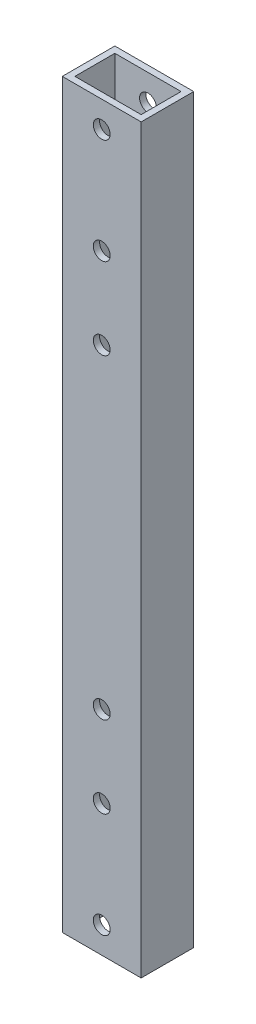
ISO-10303-21;
HEADER;
FILE_DESCRIPTION(('STEP AP214'),'2;1');
FILE_NAME('part.step','',(''),(''),'','','');
FILE_SCHEMA(('AUTOMOTIVE_DESIGN { 1 0 10303 214 1 1 1 1 }'));
ENDSEC;
DATA;
#1=APPLICATION_CONTEXT('core data for automotive mechanical design processes');
#2=APPLICATION_PROTOCOL_DEFINITION('international standard','automotive_design',2000,#1);
#3=PRODUCT_CONTEXT('',#1,'mechanical');
#4=PRODUCT('Part','Part','',(#3));
#5=PRODUCT_RELATED_PRODUCT_CATEGORY('part','',(#4));
#6=PRODUCT_DEFINITION_FORMATION('','',#4);
#7=PRODUCT_DEFINITION_CONTEXT('part definition',#1,'design');
#8=PRODUCT_DEFINITION('design','',#6,#7);
#9=PRODUCT_DEFINITION_SHAPE('','',#8);
#10=(LENGTH_UNIT() NAMED_UNIT(*) SI_UNIT(.MILLI.,.METRE.));
#11=(NAMED_UNIT(*) PLANE_ANGLE_UNIT() SI_UNIT($,.RADIAN.));
#12=(NAMED_UNIT(*) SI_UNIT($,.STERADIAN.) SOLID_ANGLE_UNIT());
#13=UNCERTAINTY_MEASURE_WITH_UNIT(LENGTH_MEASURE(1.E-05),#10,'distance_accuracy_value','');
#14=(GEOMETRIC_REPRESENTATION_CONTEXT(3) GLOBAL_UNCERTAINTY_ASSIGNED_CONTEXT((#13)) GLOBAL_UNIT_ASSIGNED_CONTEXT((#10,
#11,#12)) REPRESENTATION_CONTEXT('',''));
#15=CARTESIAN_POINT('',(0.,0.,0.));
#16=DIRECTION('',(0.,0.,1.));
#17=DIRECTION('',(1.,0.,0.));
#18=AXIS2_PLACEMENT_3D('',#15,#16,#17);
#19=CARTESIAN_POINT('',(0.,70.5,0.));
#20=DIRECTION('',(0.,1.,0.));
#21=DIRECTION('',(0.,0.,1.));
#22=AXIS2_PLACEMENT_3D('',#19,#20,#21);
#23=PLANE('',#22);
#24=DIRECTION('',(0.,0.,-1.));
#25=VECTOR('',#24,1.);
#26=CARTESIAN_POINT('',(7.5,70.5,-5.));
#27=LINE('',#26,#25);
#28=CARTESIAN_POINT('',(7.5,70.5,5.));
#29=VERTEX_POINT('',#28);
#30=CARTESIAN_POINT('',(7.5,70.5,-5.));
#31=VERTEX_POINT('',#30);
#32=EDGE_CURVE('E146',#29,#31,#27,.T.);
#33=ORIENTED_EDGE('',*,*,#32,.T.);
#34=DIRECTION('',(-1.,0.,0.));
#35=VECTOR('',#34,1.);
#36=CARTESIAN_POINT('',(-7.5,70.5,-5.));
#37=LINE('',#36,#35);
#38=CARTESIAN_POINT('',(-7.5,70.5,-5.));
#39=VERTEX_POINT('',#38);
#40=EDGE_CURVE('E149',#31,#39,#37,.T.);
#41=ORIENTED_EDGE('',*,*,#40,.T.);
#42=DIRECTION('',(0.,0.,1.));
#43=VECTOR('',#42,1.);
#44=CARTESIAN_POINT('',(-7.5,70.5,-5.));
#45=LINE('',#44,#43);
#46=CARTESIAN_POINT('',(-7.5,70.5,5.));
#47=VERTEX_POINT('',#46);
#48=EDGE_CURVE('E152',#39,#47,#45,.T.);
#49=ORIENTED_EDGE('',*,*,#48,.T.);
#50=DIRECTION('',(1.,0.,0.));
#51=VECTOR('',#50,1.);
#52=CARTESIAN_POINT('',(-7.5,70.5,5.));
#53=LINE('',#52,#51);
#54=EDGE_CURVE('E154',#47,#29,#53,.T.);
#55=ORIENTED_EDGE('',*,*,#54,.T.);
#56=EDGE_LOOP('',(#33,#41,#49,#55));
#57=FACE_BOUND('',#56,.T.);
#58=DIRECTION('',(1.,0.,0.));
#59=VECTOR('',#58,1.);
#60=CARTESIAN_POINT('',(-6.3,70.5,3.8));
#61=LINE('',#60,#59);
#62=CARTESIAN_POINT('',(-6.3,70.5,3.8));
#63=VERTEX_POINT('',#62);
#64=CARTESIAN_POINT('',(6.3,70.5,3.8));
#65=VERTEX_POINT('',#64);
#66=EDGE_CURVE('E116',#63,#65,#61,.T.);
#67=ORIENTED_EDGE('',*,*,#66,.F.);
#68=DIRECTION('',(0.,0.,1.));
#69=VECTOR('',#68,1.);
#70=CARTESIAN_POINT('',(-6.3,70.5,-3.8));
#71=LINE('',#70,#69);
#72=CARTESIAN_POINT('',(-6.3,70.5,-3.8));
#73=VERTEX_POINT('',#72);
#74=EDGE_CURVE('E108',#73,#63,#71,.T.);
#75=ORIENTED_EDGE('',*,*,#74,.F.);
#76=DIRECTION('',(-1.,0.,0.));
#77=VECTOR('',#76,1.);
#78=CARTESIAN_POINT('',(-6.3,70.5,-3.8));
#79=LINE('',#78,#77);
#80=CARTESIAN_POINT('',(6.3,70.5,-3.8));
#81=VERTEX_POINT('',#80);
#82=EDGE_CURVE('E130',#81,#73,#79,.T.);
#83=ORIENTED_EDGE('',*,*,#82,.F.);
#84=DIRECTION('',(0.,0.,-1.));
#85=VECTOR('',#84,1.);
#86=CARTESIAN_POINT('',(6.3,70.5,-3.8));
#87=LINE('',#86,#85);
#88=EDGE_CURVE('E128',#65,#81,#87,.T.);
#89=ORIENTED_EDGE('',*,*,#88,.F.);
#90=EDGE_LOOP('',(#67,#75,#83,#89));
#91=FACE_BOUND('',#90,.T.);
#92=ADVANCED_FACE('F41',(#57,#91),#23,.T.);
#93=CARTESIAN_POINT('',(0.,-70.5,0.));
#94=DIRECTION('',(0.,1.,0.));
#95=DIRECTION('',(0.,0.,1.));
#96=AXIS2_PLACEMENT_3D('',#93,#94,#95);
#97=PLANE('',#96);
#98=DIRECTION('',(0.,0.,-1.));
#99=VECTOR('',#98,1.);
#100=CARTESIAN_POINT('',(7.5,-70.5,-5.));
#101=LINE('',#100,#99);
#102=CARTESIAN_POINT('',(7.5,-70.5,5.));
#103=VERTEX_POINT('',#102);
#104=CARTESIAN_POINT('',(7.5,-70.5,-5.));
#105=VERTEX_POINT('',#104);
#106=EDGE_CURVE('E124',#103,#105,#101,.T.);
#107=ORIENTED_EDGE('',*,*,#106,.F.);
#108=DIRECTION('',(1.,0.,0.));
#109=VECTOR('',#108,1.);
#110=CARTESIAN_POINT('',(-7.5,-70.5,5.));
#111=LINE('',#110,#109);
#112=CARTESIAN_POINT('',(-7.5,-70.5,5.));
#113=VERTEX_POINT('',#112);
#114=EDGE_CURVE('E150',#113,#103,#111,.T.);
#115=ORIENTED_EDGE('',*,*,#114,.F.);
#116=DIRECTION('',(0.,0.,1.));
#117=VECTOR('',#116,1.);
#118=CARTESIAN_POINT('',(-7.5,-70.5,-5.));
#119=LINE('',#118,#117);
#120=CARTESIAN_POINT('',(-7.5,-70.5,-5.));
#121=VERTEX_POINT('',#120);
#122=EDGE_CURVE('E161',#121,#113,#119,.T.);
#123=ORIENTED_EDGE('',*,*,#122,.F.);
#124=DIRECTION('',(-1.,0.,0.));
#125=VECTOR('',#124,1.);
#126=CARTESIAN_POINT('',(-7.5,-70.5,-5.));
#127=LINE('',#126,#125);
#128=EDGE_CURVE('E159',#105,#121,#127,.T.);
#129=ORIENTED_EDGE('',*,*,#128,.F.);
#130=EDGE_LOOP('',(#107,#115,#123,#129));
#131=FACE_BOUND('',#130,.T.);
#132=DIRECTION('',(0.,0.,1.));
#133=VECTOR('',#132,1.);
#134=CARTESIAN_POINT('',(-6.3,-70.5,-3.8));
#135=LINE('',#134,#133);
#136=CARTESIAN_POINT('',(-6.3,-70.5,-3.8));
#137=VERTEX_POINT('',#136);
#138=CARTESIAN_POINT('',(-6.3,-70.5,3.8));
#139=VERTEX_POINT('',#138);
#140=EDGE_CURVE('E66',#137,#139,#135,.T.);
#141=ORIENTED_EDGE('',*,*,#140,.T.);
#142=DIRECTION('',(1.,0.,0.));
#143=VECTOR('',#142,1.);
#144=CARTESIAN_POINT('',(-6.3,-70.5,3.8));
#145=LINE('',#144,#143);
#146=CARTESIAN_POINT('',(6.3,-70.5,3.8));
#147=VERTEX_POINT('',#146);
#148=EDGE_CURVE('E123',#139,#147,#145,.T.);
#149=ORIENTED_EDGE('',*,*,#148,.T.);
#150=DIRECTION('',(0.,0.,-1.));
#151=VECTOR('',#150,1.);
#152=CARTESIAN_POINT('',(6.3,-70.5,-3.8));
#153=LINE('',#152,#151);
#154=CARTESIAN_POINT('',(6.3,-70.5,-3.8));
#155=VERTEX_POINT('',#154);
#156=EDGE_CURVE('E138',#147,#155,#153,.T.);
#157=ORIENTED_EDGE('',*,*,#156,.T.);
#158=DIRECTION('',(-1.,0.,0.));
#159=VECTOR('',#158,1.);
#160=CARTESIAN_POINT('',(-6.3,-70.5,-3.8));
#161=LINE('',#160,#159);
#162=EDGE_CURVE('E117',#155,#137,#161,.T.);
#163=ORIENTED_EDGE('',*,*,#162,.T.);
#164=EDGE_LOOP('',(#141,#149,#157,#163));
#165=FACE_BOUND('',#164,.T.);
#166=ADVANCED_FACE('F268',(#131,#165),#97,.F.);
#167=CARTESIAN_POINT('',(7.5,70.5,-5.));
#168=DIRECTION('',(-1.,0.,0.));
#169=DIRECTION('',(0.,0.,1.));
#170=AXIS2_PLACEMENT_3D('',#167,#168,#169);
#171=PLANE('',#170);
#172=ORIENTED_EDGE('',*,*,#106,.T.);
#173=DIRECTION('',(0.,-1.,0.));
#174=VECTOR('',#173,1.);
#175=CARTESIAN_POINT('',(7.5,70.5,-5.));
#176=LINE('',#175,#174);
#177=EDGE_CURVE('E11',#31,#105,#176,.T.);
#178=ORIENTED_EDGE('',*,*,#177,.F.);
#179=ORIENTED_EDGE('',*,*,#32,.F.);
#180=DIRECTION('',(0.,-1.,0.));
#181=VECTOR('',#180,1.);
#182=CARTESIAN_POINT('',(7.5,70.5,5.));
#183=LINE('',#182,#181);
#184=EDGE_CURVE('E156',#29,#103,#183,.T.);
#185=ORIENTED_EDGE('',*,*,#184,.T.);
#186=EDGE_LOOP('',(#172,#178,#179,#185));
#187=FACE_BOUND('',#186,.T.);
#188=ADVANCED_FACE('F43',(#187),#171,.F.);
#189=CARTESIAN_POINT('',(-7.5,70.5,-5.));
#190=DIRECTION('',(0.,0.,1.));
#191=DIRECTION('',(1.,0.,0.));
#192=AXIS2_PLACEMENT_3D('',#189,#190,#191);
#193=PLANE('',#192);
#194=CARTESIAN_POINT('',(3.99680288865056E-12,-29.9999999999937,-5.));
#195=DIRECTION('',(0.,0.,-1.));
#196=DIRECTION('',(-1.,0.,0.));
#197=AXIS2_PLACEMENT_3D('',#194,#195,#196);
#198=CIRCLE('',#197,1.60000000000185);
#199=CARTESIAN_POINT('',(-1.59999999999785,-29.9999999999937,-5.));
#200=VERTEX_POINT('',#199);
#201=EDGE_CURVE('E199',#200,#200,#198,.T.);
#202=ORIENTED_EDGE('',*,*,#201,.F.);
#203=EDGE_LOOP('',(#202));
#204=FACE_BOUND('',#203,.T.);
#205=CARTESIAN_POINT('',(3.99680288865056E-12,30.0000000000063,-5.));
#206=DIRECTION('',(0.,0.,-1.));
#207=DIRECTION('',(-1.,0.,0.));
#208=AXIS2_PLACEMENT_3D('',#205,#206,#207);
#209=CIRCLE('',#208,1.60000000000185);
#210=CARTESIAN_POINT('',(-1.59999999999785,30.0000000000063,-5.));
#211=VERTEX_POINT('',#210);
#212=EDGE_CURVE('E204',#211,#211,#209,.T.);
#213=ORIENTED_EDGE('',*,*,#212,.F.);
#214=EDGE_LOOP('',(#213));
#215=FACE_BOUND('',#214,.T.);
#216=CARTESIAN_POINT('',(0.,-65.5,-5.));
#217=DIRECTION('',(0.,0.,-1.));
#218=DIRECTION('',(-1.,0.,0.));
#219=AXIS2_PLACEMENT_3D('',#216,#217,#218);
#220=CIRCLE('',#219,1.60000000000001);
#221=CARTESIAN_POINT('',(-1.60000000000001,-65.5,-5.));
#222=VERTEX_POINT('',#221);
#223=EDGE_CURVE('E175',#222,#222,#220,.T.);
#224=ORIENTED_EDGE('',*,*,#223,.F.);
#225=EDGE_LOOP('',(#224));
#226=FACE_BOUND('',#225,.T.);
#227=CARTESIAN_POINT('',(0.,-45.5,-5.));
#228=DIRECTION('',(0.,0.,-1.));
#229=DIRECTION('',(-1.,0.,0.));
#230=AXIS2_PLACEMENT_3D('',#227,#228,#229);
#231=CIRCLE('',#230,1.6);
#232=CARTESIAN_POINT('',(-1.6,-45.5,-5.));
#233=VERTEX_POINT('',#232);
#234=EDGE_CURVE('E218',#233,#233,#231,.T.);
#235=ORIENTED_EDGE('',*,*,#234,.F.);
#236=EDGE_LOOP('',(#235));
#237=FACE_BOUND('',#236,.T.);
#238=CARTESIAN_POINT('',(0.,45.5,-5.));
#239=DIRECTION('',(0.,0.,-1.));
#240=DIRECTION('',(1.,0.,0.));
#241=AXIS2_PLACEMENT_3D('',#238,#239,#240);
#242=CIRCLE('',#241,1.6);
#243=CARTESIAN_POINT('',(1.59999999999999,45.5,-5.));
#244=VERTEX_POINT('',#243);
#245=EDGE_CURVE('E221',#244,#244,#242,.T.);
#246=ORIENTED_EDGE('',*,*,#245,.F.);
#247=EDGE_LOOP('',(#246));
#248=FACE_BOUND('',#247,.T.);
#249=CARTESIAN_POINT('',(0.,65.5,-5.));
#250=DIRECTION('',(0.,0.,-1.));
#251=DIRECTION('',(1.,0.,0.));
#252=AXIS2_PLACEMENT_3D('',#249,#250,#251);
#253=CIRCLE('',#252,1.60000000000001);
#254=CARTESIAN_POINT('',(1.6,65.5,-5.));
#255=VERTEX_POINT('',#254);
#256=EDGE_CURVE('E215',#255,#255,#253,.T.);
#257=ORIENTED_EDGE('',*,*,#256,.F.);
#258=EDGE_LOOP('',(#257));
#259=FACE_BOUND('',#258,.T.);
#260=ORIENTED_EDGE('',*,*,#128,.T.);
#261=DIRECTION('',(0.,-1.,0.));
#262=VECTOR('',#261,1.);
#263=CARTESIAN_POINT('',(-7.5,70.5,-5.));
#264=LINE('',#263,#262);
#265=EDGE_CURVE('E50',#39,#121,#264,.T.);
#266=ORIENTED_EDGE('',*,*,#265,.F.);
#267=ORIENTED_EDGE('',*,*,#40,.F.);
#268=ORIENTED_EDGE('',*,*,#177,.T.);
#269=EDGE_LOOP('',(#260,#266,#267,#268));
#270=FACE_BOUND('',#269,.T.);
#271=ADVANCED_FACE('F283',(#204,#215,#226,#237,#248,#259,#270),#193,.F.);
#272=CARTESIAN_POINT('',(-7.5,70.5,-5.));
#273=DIRECTION('',(1.,0.,0.));
#274=DIRECTION('',(0.,0.,-1.));
#275=AXIS2_PLACEMENT_3D('',#272,#273,#274);
#276=PLANE('',#275);
#277=ORIENTED_EDGE('',*,*,#122,.T.);
#278=DIRECTION('',(0.,-1.,0.));
#279=VECTOR('',#278,1.);
#280=CARTESIAN_POINT('',(-7.5,70.5,5.));
#281=LINE('',#280,#279);
#282=EDGE_CURVE('E166',#47,#113,#281,.T.);
#283=ORIENTED_EDGE('',*,*,#282,.F.);
#284=ORIENTED_EDGE('',*,*,#48,.F.);
#285=ORIENTED_EDGE('',*,*,#265,.T.);
#286=EDGE_LOOP('',(#277,#283,#284,#285));
#287=FACE_BOUND('',#286,.T.);
#288=ADVANCED_FACE('F281',(#287),#276,.F.);
#289=CARTESIAN_POINT('',(-7.5,70.5,5.));
#290=DIRECTION('',(0.,0.,-1.));
#291=DIRECTION('',(-1.,0.,0.));
#292=AXIS2_PLACEMENT_3D('',#289,#290,#291);
#293=PLANE('',#292);
#294=CARTESIAN_POINT('',(3.99680288865056E-12,-29.9999999999937,5.));
#295=DIRECTION('',(0.,0.,-1.));
#296=DIRECTION('',(-1.,0.,0.));
#297=AXIS2_PLACEMENT_3D('',#294,#295,#296);
#298=CIRCLE('',#297,1.60000000000185);
#299=CARTESIAN_POINT('',(-1.59999999999785,-29.9999999999937,5.));
#300=VERTEX_POINT('',#299);
#301=EDGE_CURVE('E193',#300,#300,#298,.T.);
#302=ORIENTED_EDGE('',*,*,#301,.T.);
#303=EDGE_LOOP('',(#302));
#304=FACE_BOUND('',#303,.T.);
#305=CARTESIAN_POINT('',(3.99680288865056E-12,30.0000000000063,5.));
#306=DIRECTION('',(0.,0.,-1.));
#307=DIRECTION('',(-1.,0.,0.));
#308=AXIS2_PLACEMENT_3D('',#305,#306,#307);
#309=CIRCLE('',#308,1.60000000000185);
#310=CARTESIAN_POINT('',(-1.59999999999785,30.0000000000063,5.));
#311=VERTEX_POINT('',#310);
#312=EDGE_CURVE('E209',#311,#311,#309,.T.);
#313=ORIENTED_EDGE('',*,*,#312,.T.);
#314=EDGE_LOOP('',(#313));
#315=FACE_BOUND('',#314,.T.);
#316=CARTESIAN_POINT('',(0.,-65.5,5.));
#317=DIRECTION('',(0.,0.,-1.));
#318=DIRECTION('',(-1.,0.,0.));
#319=AXIS2_PLACEMENT_3D('',#316,#317,#318);
#320=CIRCLE('',#319,1.60000000000001);
#321=CARTESIAN_POINT('',(-1.60000000000001,-65.5,5.));
#322=VERTEX_POINT('',#321);
#323=EDGE_CURVE('E136',#322,#322,#320,.T.);
#324=ORIENTED_EDGE('',*,*,#323,.T.);
#325=EDGE_LOOP('',(#324));
#326=FACE_BOUND('',#325,.T.);
#327=CARTESIAN_POINT('',(0.,-45.5,5.));
#328=DIRECTION('',(0.,0.,-1.));
#329=DIRECTION('',(-1.,0.,0.));
#330=AXIS2_PLACEMENT_3D('',#327,#328,#329);
#331=CIRCLE('',#330,1.6);
#332=CARTESIAN_POINT('',(-1.6,-45.5,5.));
#333=VERTEX_POINT('',#332);
#334=EDGE_CURVE('E189',#333,#333,#331,.T.);
#335=ORIENTED_EDGE('',*,*,#334,.T.);
#336=EDGE_LOOP('',(#335));
#337=FACE_BOUND('',#336,.T.);
#338=CARTESIAN_POINT('',(0.,45.5,5.));
#339=DIRECTION('',(0.,0.,-1.));
#340=DIRECTION('',(-1.,0.,0.));
#341=AXIS2_PLACEMENT_3D('',#338,#339,#340);
#342=CIRCLE('',#341,1.6);
#343=CARTESIAN_POINT('',(-1.6,45.5,5.));
#344=VERTEX_POINT('',#343);
#345=EDGE_CURVE('E185',#344,#344,#342,.T.);
#346=ORIENTED_EDGE('',*,*,#345,.T.);
#347=EDGE_LOOP('',(#346));
#348=FACE_BOUND('',#347,.T.);
#349=CARTESIAN_POINT('',(0.,65.5,5.));
#350=DIRECTION('',(0.,0.,-1.));
#351=DIRECTION('',(-1.,0.,0.));
#352=AXIS2_PLACEMENT_3D('',#349,#350,#351);
#353=CIRCLE('',#352,1.60000000000001);
#354=CARTESIAN_POINT('',(-1.60000000000001,65.5,5.));
#355=VERTEX_POINT('',#354);
#356=EDGE_CURVE('E180',#355,#355,#353,.T.);
#357=ORIENTED_EDGE('',*,*,#356,.T.);
#358=EDGE_LOOP('',(#357));
#359=FACE_BOUND('',#358,.T.);
#360=ORIENTED_EDGE('',*,*,#114,.T.);
#361=ORIENTED_EDGE('',*,*,#184,.F.);
#362=ORIENTED_EDGE('',*,*,#54,.F.);
#363=ORIENTED_EDGE('',*,*,#282,.T.);
#364=EDGE_LOOP('',(#360,#361,#362,#363));
#365=FACE_BOUND('',#364,.T.);
#366=ADVANCED_FACE('F242',(#304,#315,#326,#337,#348,#359,#365),#293,.F.);
#367=CARTESIAN_POINT('',(-6.3,70.5,-3.8));
#368=DIRECTION('',(1.,0.,0.));
#369=DIRECTION('',(0.,0.,-1.));
#370=AXIS2_PLACEMENT_3D('',#367,#368,#369);
#371=PLANE('',#370);
#372=ORIENTED_EDGE('',*,*,#140,.F.);
#373=DIRECTION('',(0.,-1.,0.));
#374=VECTOR('',#373,1.);
#375=CARTESIAN_POINT('',(-6.3,70.5,-3.8));
#376=LINE('',#375,#374);
#377=EDGE_CURVE('E112',#73,#137,#376,.T.);
#378=ORIENTED_EDGE('',*,*,#377,.F.);
#379=ORIENTED_EDGE('',*,*,#74,.T.);
#380=DIRECTION('',(0.,-1.,0.));
#381=VECTOR('',#380,1.);
#382=CARTESIAN_POINT('',(-6.3,70.5,3.8));
#383=LINE('',#382,#381);
#384=EDGE_CURVE('E111',#63,#139,#383,.T.);
#385=ORIENTED_EDGE('',*,*,#384,.T.);
#386=EDGE_LOOP('',(#372,#378,#379,#385));
#387=FACE_BOUND('',#386,.T.);
#388=ADVANCED_FACE('F110',(#387),#371,.T.);
#389=CARTESIAN_POINT('',(-6.3,70.5,3.8));
#390=DIRECTION('',(0.,0.,-1.));
#391=DIRECTION('',(-1.,0.,0.));
#392=AXIS2_PLACEMENT_3D('',#389,#390,#391);
#393=PLANE('',#392);
#394=CARTESIAN_POINT('',(3.99680288865056E-12,-29.9999999999937,3.8));
#395=DIRECTION('',(0.,0.,-1.));
#396=DIRECTION('',(-1.,0.,0.));
#397=AXIS2_PLACEMENT_3D('',#394,#395,#396);
#398=CIRCLE('',#397,1.60000000000185);
#399=CARTESIAN_POINT('',(-1.59999999999785,-29.9999999999937,3.8));
#400=VERTEX_POINT('',#399);
#401=EDGE_CURVE('E212',#400,#400,#398,.T.);
#402=ORIENTED_EDGE('',*,*,#401,.F.);
#403=EDGE_LOOP('',(#402));
#404=FACE_BOUND('',#403,.T.);
#405=CARTESIAN_POINT('',(3.99680288865056E-12,30.0000000000063,3.8));
#406=DIRECTION('',(0.,0.,-1.));
#407=DIRECTION('',(-1.,0.,0.));
#408=AXIS2_PLACEMENT_3D('',#405,#406,#407);
#409=CIRCLE('',#408,1.60000000000185);
#410=CARTESIAN_POINT('',(-1.59999999999785,30.0000000000063,3.8));
#411=VERTEX_POINT('',#410);
#412=EDGE_CURVE('E192',#411,#411,#409,.T.);
#413=ORIENTED_EDGE('',*,*,#412,.F.);
#414=EDGE_LOOP('',(#413));
#415=FACE_BOUND('',#414,.T.);
#416=CARTESIAN_POINT('',(0.,-65.5,3.8));
#417=DIRECTION('',(0.,0.,-1.));
#418=DIRECTION('',(-1.,0.,0.));
#419=AXIS2_PLACEMENT_3D('',#416,#417,#418);
#420=CIRCLE('',#419,1.60000000000001);
#421=CARTESIAN_POINT('',(-1.60000000000001,-65.5,3.8));
#422=VERTEX_POINT('',#421);
#423=EDGE_CURVE('E188',#422,#422,#420,.T.);
#424=ORIENTED_EDGE('',*,*,#423,.F.);
#425=EDGE_LOOP('',(#424));
#426=FACE_BOUND('',#425,.T.);
#427=CARTESIAN_POINT('',(0.,-45.5,3.8));
#428=DIRECTION('',(0.,0.,-1.));
#429=DIRECTION('',(-1.,0.,0.));
#430=AXIS2_PLACEMENT_3D('',#427,#428,#429);
#431=CIRCLE('',#430,1.6);
#432=CARTESIAN_POINT('',(-1.6,-45.5,3.8));
#433=VERTEX_POINT('',#432);
#434=EDGE_CURVE('E184',#433,#433,#431,.T.);
#435=ORIENTED_EDGE('',*,*,#434,.F.);
#436=EDGE_LOOP('',(#435));
#437=FACE_BOUND('',#436,.T.);
#438=CARTESIAN_POINT('',(0.,45.5,3.8));
#439=DIRECTION('',(0.,0.,-1.));
#440=DIRECTION('',(-1.,0.,0.));
#441=AXIS2_PLACEMENT_3D('',#438,#439,#440);
#442=CIRCLE('',#441,1.6);
#443=CARTESIAN_POINT('',(-1.6,45.5,3.8));
#444=VERTEX_POINT('',#443);
#445=EDGE_CURVE('E179',#444,#444,#442,.T.);
#446=ORIENTED_EDGE('',*,*,#445,.F.);
#447=EDGE_LOOP('',(#446));
#448=FACE_BOUND('',#447,.T.);
#449=CARTESIAN_POINT('',(0.,65.5,3.8));
#450=DIRECTION('',(0.,0.,-1.));
#451=DIRECTION('',(-1.,0.,0.));
#452=AXIS2_PLACEMENT_3D('',#449,#450,#451);
#453=CIRCLE('',#452,1.60000000000001);
#454=CARTESIAN_POINT('',(-1.60000000000001,65.5,3.8));
#455=VERTEX_POINT('',#454);
#456=EDGE_CURVE('E174',#455,#455,#453,.T.);
#457=ORIENTED_EDGE('',*,*,#456,.F.);
#458=EDGE_LOOP('',(#457));
#459=FACE_BOUND('',#458,.T.);
#460=ORIENTED_EDGE('',*,*,#148,.F.);
#461=ORIENTED_EDGE('',*,*,#384,.F.);
#462=ORIENTED_EDGE('',*,*,#66,.T.);
#463=DIRECTION('',(0.,-1.,0.));
#464=VECTOR('',#463,1.);
#465=CARTESIAN_POINT('',(6.3,70.5,3.8));
#466=LINE('',#465,#464);
#467=EDGE_CURVE('E125',#65,#147,#466,.T.);
#468=ORIENTED_EDGE('',*,*,#467,.T.);
#469=EDGE_LOOP('',(#460,#461,#462,#468));
#470=FACE_BOUND('',#469,.T.);
#471=ADVANCED_FACE('F120',(#404,#415,#426,#437,#448,#459,#470),#393,.T.);
#472=CARTESIAN_POINT('',(6.3,70.5,-3.8));
#473=DIRECTION('',(-1.,0.,0.));
#474=DIRECTION('',(0.,0.,1.));
#475=AXIS2_PLACEMENT_3D('',#472,#473,#474);
#476=PLANE('',#475);
#477=ORIENTED_EDGE('',*,*,#156,.F.);
#478=ORIENTED_EDGE('',*,*,#467,.F.);
#479=ORIENTED_EDGE('',*,*,#88,.T.);
#480=DIRECTION('',(0.,-1.,0.));
#481=VECTOR('',#480,1.);
#482=CARTESIAN_POINT('',(6.3,70.5,-3.8));
#483=LINE('',#482,#481);
#484=EDGE_CURVE('E58',#81,#155,#483,.T.);
#485=ORIENTED_EDGE('',*,*,#484,.T.);
#486=EDGE_LOOP('',(#477,#478,#479,#485));
#487=FACE_BOUND('',#486,.T.);
#488=ADVANCED_FACE('F318',(#487),#476,.T.);
#489=CARTESIAN_POINT('',(-6.3,70.5,-3.8));
#490=DIRECTION('',(0.,0.,1.));
#491=DIRECTION('',(1.,0.,0.));
#492=AXIS2_PLACEMENT_3D('',#489,#490,#491);
#493=PLANE('',#492);
#494=CARTESIAN_POINT('',(3.99680288865056E-12,-29.9999999999937,-3.8));
#495=DIRECTION('',(0.,0.,1.));
#496=DIRECTION('',(1.,0.,0.));
#497=AXIS2_PLACEMENT_3D('',#494,#495,#496);
#498=CIRCLE('',#497,1.60000000000185);
#499=CARTESIAN_POINT('',(1.60000000000584,-29.9999999999937,-3.8));
#500=VERTEX_POINT('',#499);
#501=EDGE_CURVE('E45',#500,#500,#498,.T.);
#502=ORIENTED_EDGE('',*,*,#501,.F.);
#503=EDGE_LOOP('',(#502));
#504=FACE_BOUND('',#503,.T.);
#505=CARTESIAN_POINT('',(3.99680288865056E-12,30.0000000000063,-3.8));
#506=DIRECTION('',(0.,0.,1.));
#507=DIRECTION('',(1.,0.,0.));
#508=AXIS2_PLACEMENT_3D('',#505,#506,#507);
#509=CIRCLE('',#508,1.60000000000185);
#510=CARTESIAN_POINT('',(1.60000000000584,30.0000000000063,-3.8));
#511=VERTEX_POINT('',#510);
#512=EDGE_CURVE('E190',#511,#511,#509,.T.);
#513=ORIENTED_EDGE('',*,*,#512,.F.);
#514=EDGE_LOOP('',(#513));
#515=FACE_BOUND('',#514,.T.);
#516=CARTESIAN_POINT('',(0.,-65.5,-3.8));
#517=DIRECTION('',(0.,0.,1.));
#518=DIRECTION('',(1.,0.,0.));
#519=AXIS2_PLACEMENT_3D('',#516,#517,#518);
#520=CIRCLE('',#519,1.60000000000001);
#521=CARTESIAN_POINT('',(1.6,-65.5,-3.8));
#522=VERTEX_POINT('',#521);
#523=EDGE_CURVE('E186',#522,#522,#520,.T.);
#524=ORIENTED_EDGE('',*,*,#523,.F.);
#525=EDGE_LOOP('',(#524));
#526=FACE_BOUND('',#525,.T.);
#527=CARTESIAN_POINT('',(0.,-45.5,-3.8));
#528=DIRECTION('',(0.,0.,1.));
#529=DIRECTION('',(1.,0.,0.));
#530=AXIS2_PLACEMENT_3D('',#527,#528,#529);
#531=CIRCLE('',#530,1.6);
#532=CARTESIAN_POINT('',(1.59999999999999,-45.5,-3.8));
#533=VERTEX_POINT('',#532);
#534=EDGE_CURVE('E181',#533,#533,#531,.T.);
#535=ORIENTED_EDGE('',*,*,#534,.F.);
#536=EDGE_LOOP('',(#535));
#537=FACE_BOUND('',#536,.T.);
#538=CARTESIAN_POINT('',(0.,45.5,-3.8));
#539=DIRECTION('',(0.,0.,1.));
#540=DIRECTION('',(1.,0.,0.));
#541=AXIS2_PLACEMENT_3D('',#538,#539,#540);
#542=CIRCLE('',#541,1.6);
#543=CARTESIAN_POINT('',(1.59999999999999,45.5,-3.8));
#544=VERTEX_POINT('',#543);
#545=EDGE_CURVE('E176',#544,#544,#542,.T.);
#546=ORIENTED_EDGE('',*,*,#545,.F.);
#547=EDGE_LOOP('',(#546));
#548=FACE_BOUND('',#547,.T.);
#549=CARTESIAN_POINT('',(0.,65.5,-3.8));
#550=DIRECTION('',(0.,0.,1.));
#551=DIRECTION('',(1.,0.,0.));
#552=AXIS2_PLACEMENT_3D('',#549,#550,#551);
#553=CIRCLE('',#552,1.60000000000001);
#554=CARTESIAN_POINT('',(1.6,65.5,-3.8));
#555=VERTEX_POINT('',#554);
#556=EDGE_CURVE('E171',#555,#555,#553,.T.);
#557=ORIENTED_EDGE('',*,*,#556,.F.);
#558=EDGE_LOOP('',(#557));
#559=FACE_BOUND('',#558,.T.);
#560=ORIENTED_EDGE('',*,*,#162,.F.);
#561=ORIENTED_EDGE('',*,*,#484,.F.);
#562=ORIENTED_EDGE('',*,*,#82,.T.);
#563=ORIENTED_EDGE('',*,*,#377,.T.);
#564=EDGE_LOOP('',(#560,#561,#562,#563));
#565=FACE_BOUND('',#564,.T.);
#566=ADVANCED_FACE('F315',(#504,#515,#526,#537,#548,#559,#565),#493,.T.);
#567=CARTESIAN_POINT('',(0.,65.5,95.));
#568=DIRECTION('',(0.,0.,-1.));
#569=DIRECTION('',(-1.,0.,0.));
#570=AXIS2_PLACEMENT_3D('',#567,#568,#569);
#571=CYLINDRICAL_SURFACE('',#570,1.60000000000001);
#572=ORIENTED_EDGE('',*,*,#556,.T.);
#573=EDGE_LOOP('',(#572));
#574=FACE_BOUND('',#573,.T.);
#575=ORIENTED_EDGE('',*,*,#256,.T.);
#576=EDGE_LOOP('',(#575));
#577=FACE_BOUND('',#576,.T.);
#578=ADVANCED_FACE('F317',(#574,#577),#571,.F.);
#579=CARTESIAN_POINT('',(0.,45.5,95.));
#580=DIRECTION('',(0.,0.,-1.));
#581=DIRECTION('',(-1.,0.,0.));
#582=AXIS2_PLACEMENT_3D('',#579,#580,#581);
#583=CYLINDRICAL_SURFACE('',#582,1.6);
#584=ORIENTED_EDGE('',*,*,#545,.T.);
#585=EDGE_LOOP('',(#584));
#586=FACE_BOUND('',#585,.T.);
#587=ORIENTED_EDGE('',*,*,#245,.T.);
#588=EDGE_LOOP('',(#587));
#589=FACE_BOUND('',#588,.T.);
#590=ADVANCED_FACE('F325',(#586,#589),#583,.F.);
#591=CARTESIAN_POINT('',(0.,-45.5,95.));
#592=DIRECTION('',(0.,0.,-1.));
#593=DIRECTION('',(-1.,0.,0.));
#594=AXIS2_PLACEMENT_3D('',#591,#592,#593);
#595=CYLINDRICAL_SURFACE('',#594,1.6);
#596=ORIENTED_EDGE('',*,*,#534,.T.);
#597=EDGE_LOOP('',(#596));
#598=FACE_BOUND('',#597,.T.);
#599=ORIENTED_EDGE('',*,*,#234,.T.);
#600=EDGE_LOOP('',(#599));
#601=FACE_BOUND('',#600,.T.);
#602=ADVANCED_FACE('F263',(#598,#601),#595,.F.);
#603=CARTESIAN_POINT('',(0.,-65.5,95.));
#604=DIRECTION('',(0.,0.,-1.));
#605=DIRECTION('',(-1.,0.,0.));
#606=AXIS2_PLACEMENT_3D('',#603,#604,#605);
#607=CYLINDRICAL_SURFACE('',#606,1.60000000000001);
#608=ORIENTED_EDGE('',*,*,#523,.T.);
#609=EDGE_LOOP('',(#608));
#610=FACE_BOUND('',#609,.T.);
#611=ORIENTED_EDGE('',*,*,#223,.T.);
#612=EDGE_LOOP('',(#611));
#613=FACE_BOUND('',#612,.T.);
#614=ADVANCED_FACE('F251',(#610,#613),#607,.F.);
#615=ORIENTED_EDGE('',*,*,#456,.T.);
#616=EDGE_LOOP('',(#615));
#617=FACE_BOUND('',#616,.T.);
#618=ORIENTED_EDGE('',*,*,#356,.F.);
#619=EDGE_LOOP('',(#618));
#620=FACE_BOUND('',#619,.T.);
#621=ADVANCED_FACE('F265',(#617,#620),#571,.F.);
#622=ORIENTED_EDGE('',*,*,#445,.T.);
#623=EDGE_LOOP('',(#622));
#624=FACE_BOUND('',#623,.T.);
#625=ORIENTED_EDGE('',*,*,#345,.F.);
#626=EDGE_LOOP('',(#625));
#627=FACE_BOUND('',#626,.T.);
#628=ADVANCED_FACE('F260',(#624,#627),#583,.F.);
#629=ORIENTED_EDGE('',*,*,#434,.T.);
#630=EDGE_LOOP('',(#629));
#631=FACE_BOUND('',#630,.T.);
#632=ORIENTED_EDGE('',*,*,#334,.F.);
#633=EDGE_LOOP('',(#632));
#634=FACE_BOUND('',#633,.T.);
#635=ADVANCED_FACE('F248',(#631,#634),#595,.F.);
#636=ORIENTED_EDGE('',*,*,#423,.T.);
#637=EDGE_LOOP('',(#636));
#638=FACE_BOUND('',#637,.T.);
#639=ORIENTED_EDGE('',*,*,#323,.F.);
#640=EDGE_LOOP('',(#639));
#641=FACE_BOUND('',#640,.T.);
#642=ADVANCED_FACE('F245',(#638,#641),#607,.F.);
#643=CARTESIAN_POINT('',(3.99680288865056E-12,30.0000000000063,5.));
#644=DIRECTION('',(0.,0.,-1.));
#645=DIRECTION('',(-1.,0.,0.));
#646=AXIS2_PLACEMENT_3D('',#643,#644,#645);
#647=CYLINDRICAL_SURFACE('',#646,1.60000000000185);
#648=ORIENTED_EDGE('',*,*,#512,.T.);
#649=EDGE_LOOP('',(#648));
#650=FACE_BOUND('',#649,.T.);
#651=ORIENTED_EDGE('',*,*,#212,.T.);
#652=EDGE_LOOP('',(#651));
#653=FACE_BOUND('',#652,.T.);
#654=ADVANCED_FACE('F247',(#650,#653),#647,.F.);
#655=CARTESIAN_POINT('',(3.99680288865056E-12,-29.9999999999937,5.));
#656=DIRECTION('',(0.,0.,-1.));
#657=DIRECTION('',(-1.,0.,0.));
#658=AXIS2_PLACEMENT_3D('',#655,#656,#657);
#659=CYLINDRICAL_SURFACE('',#658,1.60000000000185);
#660=ORIENTED_EDGE('',*,*,#501,.T.);
#661=EDGE_LOOP('',(#660));
#662=FACE_BOUND('',#661,.T.);
#663=ORIENTED_EDGE('',*,*,#201,.T.);
#664=EDGE_LOOP('',(#663));
#665=FACE_BOUND('',#664,.T.);
#666=ADVANCED_FACE('F257',(#662,#665),#659,.F.);
#667=ORIENTED_EDGE('',*,*,#412,.T.);
#668=EDGE_LOOP('',(#667));
#669=FACE_BOUND('',#668,.T.);
#670=ORIENTED_EDGE('',*,*,#312,.F.);
#671=EDGE_LOOP('',(#670));
#672=FACE_BOUND('',#671,.T.);
#673=ADVANCED_FACE('F259',(#669,#672),#647,.F.);
#674=ORIENTED_EDGE('',*,*,#401,.T.);
#675=EDGE_LOOP('',(#674));
#676=FACE_BOUND('',#675,.T.);
#677=ORIENTED_EDGE('',*,*,#301,.F.);
#678=EDGE_LOOP('',(#677));
#679=FACE_BOUND('',#678,.T.);
#680=ADVANCED_FACE('F408',(#676,#679),#659,.F.);
#681=CLOSED_SHELL('',(#92,#166,#188,#271,#288,#366,#388,#471,#488,#566,#578,#590,#602,#614,#621,
#628,#635,#642,#654,#666,#673,#680));
#682=MANIFOLD_SOLID_BREP('B2',#681);
#683=ADVANCED_BREP_SHAPE_REPRESENTATION('',(#18,#682),#14);
#684=SHAPE_DEFINITION_REPRESENTATION(#9,#683);
ENDSEC;
END-ISO-10303-21;
